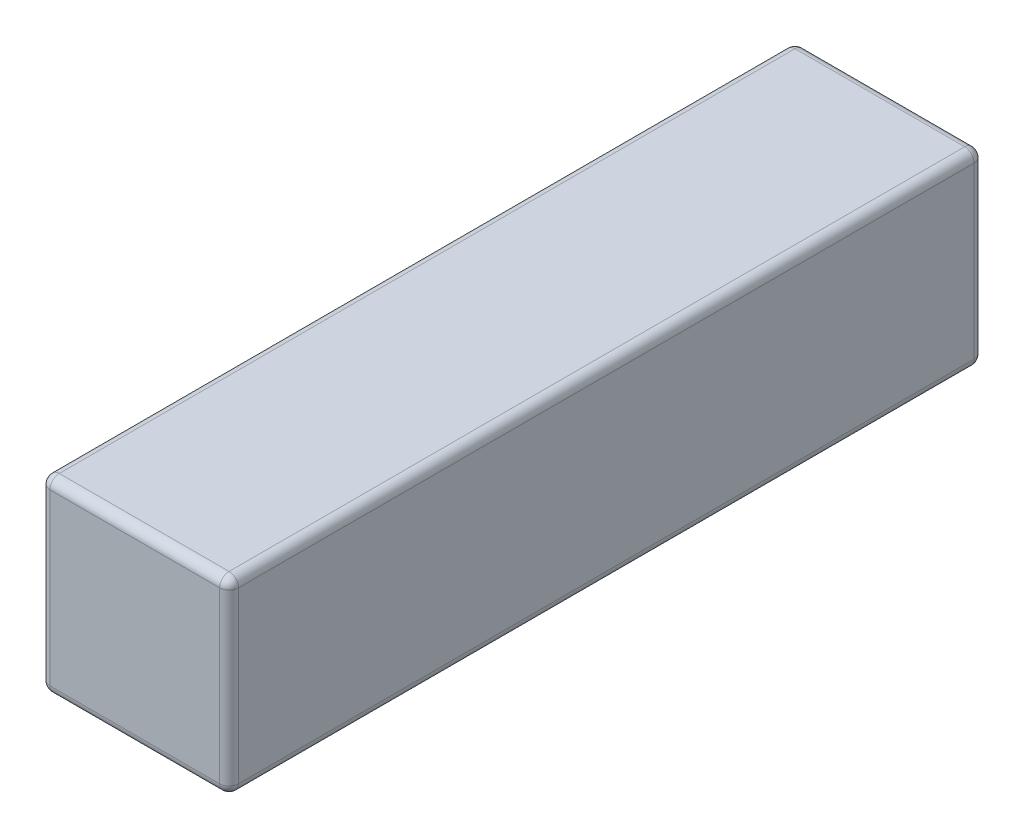
ISO-10303-21;
HEADER;
FILE_DESCRIPTION(('STEP AP214'),'2;1');
FILE_NAME('part.step','',(''),(''),'','','');
FILE_SCHEMA(('AUTOMOTIVE_DESIGN { 1 0 10303 214 1 1 1 1 }'));
ENDSEC;
DATA;
#1=APPLICATION_CONTEXT('core data for automotive mechanical design processes');
#2=APPLICATION_PROTOCOL_DEFINITION('international standard','automotive_design',2000,#1);
#3=PRODUCT_CONTEXT('',#1,'mechanical');
#4=PRODUCT('Part','Part','',(#3));
#5=PRODUCT_RELATED_PRODUCT_CATEGORY('part','',(#4));
#6=PRODUCT_DEFINITION_FORMATION('','',#4);
#7=PRODUCT_DEFINITION_CONTEXT('part definition',#1,'design');
#8=PRODUCT_DEFINITION('design','',#6,#7);
#9=PRODUCT_DEFINITION_SHAPE('','',#8);
#10=(LENGTH_UNIT() NAMED_UNIT(*) SI_UNIT(.MILLI.,.METRE.));
#11=(NAMED_UNIT(*) PLANE_ANGLE_UNIT() SI_UNIT($,.RADIAN.));
#12=(NAMED_UNIT(*) SI_UNIT($,.STERADIAN.) SOLID_ANGLE_UNIT());
#13=UNCERTAINTY_MEASURE_WITH_UNIT(LENGTH_MEASURE(1.E-05),#10,'distance_accuracy_value','');
#14=(GEOMETRIC_REPRESENTATION_CONTEXT(3) GLOBAL_UNCERTAINTY_ASSIGNED_CONTEXT((#13)) GLOBAL_UNIT_ASSIGNED_CONTEXT((#10,
#11,#12)) REPRESENTATION_CONTEXT('',''));
#15=CARTESIAN_POINT('',(0.,0.,0.));
#16=DIRECTION('',(0.,0.,1.));
#17=DIRECTION('',(1.,0.,0.));
#18=AXIS2_PLACEMENT_3D('',#15,#16,#17);
#19=CARTESIAN_POINT('',(1.5,-1.5,6.));
#20=DIRECTION('',(0.,1.,0.));
#21=DIRECTION('',(-1.,0.,0.));
#22=AXIS2_PLACEMENT_3D('',#19,#20,#21);
#23=PLANE('',#22);
#24=DIRECTION('',(1.,0.,0.));
#25=VECTOR('',#24,1.);
#26=CARTESIAN_POINT('',(1.5,-1.5,5.85));
#27=LINE('',#26,#25);
#28=CARTESIAN_POINT('',(1.35,-1.5,5.85));
#29=VERTEX_POINT('',#28);
#30=CARTESIAN_POINT('',(-1.35,-1.5,5.85));
#31=VERTEX_POINT('',#30);
#32=EDGE_CURVE('E131',#29,#31,#27,.F.);
#33=ORIENTED_EDGE('',*,*,#32,.T.);
#34=DIRECTION('',(0.,0.,-1.));
#35=VECTOR('',#34,1.);
#36=CARTESIAN_POINT('',(-1.35,-1.5,6.));
#37=LINE('',#36,#35);
#38=CARTESIAN_POINT('',(-1.35,-1.5,-5.85));
#39=VERTEX_POINT('',#38);
#40=EDGE_CURVE('E167',#31,#39,#37,.T.);
#41=ORIENTED_EDGE('',*,*,#40,.T.);
#42=DIRECTION('',(1.,0.,0.));
#43=VECTOR('',#42,1.);
#44=CARTESIAN_POINT('',(1.5,-1.5,-5.85));
#45=LINE('',#44,#43);
#46=CARTESIAN_POINT('',(1.35,-1.5,-5.85));
#47=VERTEX_POINT('',#46);
#48=EDGE_CURVE('E134',#39,#47,#45,.T.);
#49=ORIENTED_EDGE('',*,*,#48,.T.);
#50=DIRECTION('',(0.,0.,-1.));
#51=VECTOR('',#50,1.);
#52=CARTESIAN_POINT('',(1.35,-1.5,6.));
#53=LINE('',#52,#51);
#54=EDGE_CURVE('E127',#47,#29,#53,.F.);
#55=ORIENTED_EDGE('',*,*,#54,.T.);
#56=EDGE_LOOP('',(#33,#41,#49,#55));
#57=FACE_BOUND('',#56,.T.);
#58=ADVANCED_FACE('F39',(#57),#23,.F.);
#59=CARTESIAN_POINT('',(1.5,-1.5,6.));
#60=DIRECTION('',(-1.,0.,0.));
#61=DIRECTION('',(0.,0.,1.));
#62=AXIS2_PLACEMENT_3D('',#59,#60,#61);
#63=PLANE('',#62);
#64=DIRECTION('',(0.,1.,0.));
#65=VECTOR('',#64,1.);
#66=CARTESIAN_POINT('',(1.5,1.5,-5.85));
#67=LINE('',#66,#65);
#68=CARTESIAN_POINT('',(1.5,-1.35,-5.85));
#69=VERTEX_POINT('',#68);
#70=CARTESIAN_POINT('',(1.5,1.35,-5.85));
#71=VERTEX_POINT('',#70);
#72=EDGE_CURVE('E199',#69,#71,#67,.T.);
#73=ORIENTED_EDGE('',*,*,#72,.T.);
#74=DIRECTION('',(0.,0.,-1.));
#75=VECTOR('',#74,1.);
#76=CARTESIAN_POINT('',(1.5,1.35,6.));
#77=LINE('',#76,#75);
#78=CARTESIAN_POINT('',(1.5,1.35,5.85));
#79=VERTEX_POINT('',#78);
#80=EDGE_CURVE('E201',#71,#79,#77,.F.);
#81=ORIENTED_EDGE('',*,*,#80,.T.);
#82=DIRECTION('',(0.,1.,0.));
#83=VECTOR('',#82,1.);
#84=CARTESIAN_POINT('',(1.5,-1.5,5.85));
#85=LINE('',#84,#83);
#86=CARTESIAN_POINT('',(1.5,-1.35,5.85));
#87=VERTEX_POINT('',#86);
#88=EDGE_CURVE('E196',#79,#87,#85,.F.);
#89=ORIENTED_EDGE('',*,*,#88,.T.);
#90=DIRECTION('',(0.,0.,-1.));
#91=VECTOR('',#90,1.);
#92=CARTESIAN_POINT('',(1.5,-1.35,6.));
#93=LINE('',#92,#91);
#94=EDGE_CURVE('E144',#87,#69,#93,.T.);
#95=ORIENTED_EDGE('',*,*,#94,.T.);
#96=EDGE_LOOP('',(#73,#81,#89,#95));
#97=FACE_BOUND('',#96,.T.);
#98=ADVANCED_FACE('F300',(#97),#63,.F.);
#99=CARTESIAN_POINT('',(1.5,1.5,6.));
#100=DIRECTION('',(0.,-1.,0.));
#101=DIRECTION('',(1.,0.,0.));
#102=AXIS2_PLACEMENT_3D('',#99,#100,#101);
#103=PLANE('',#102);
#104=DIRECTION('',(-1.,0.,0.));
#105=VECTOR('',#104,1.);
#106=CARTESIAN_POINT('',(-1.5,1.5,-5.85));
#107=LINE('',#106,#105);
#108=CARTESIAN_POINT('',(1.35,1.5,-5.85));
#109=VERTEX_POINT('',#108);
#110=CARTESIAN_POINT('',(-1.35,1.5,-5.85));
#111=VERTEX_POINT('',#110);
#112=EDGE_CURVE('E191',#109,#111,#107,.T.);
#113=ORIENTED_EDGE('',*,*,#112,.T.);
#114=DIRECTION('',(0.,0.,-1.));
#115=VECTOR('',#114,1.);
#116=CARTESIAN_POINT('',(-1.35,1.5,6.));
#117=LINE('',#116,#115);
#118=CARTESIAN_POINT('',(-1.35,1.5,5.85));
#119=VERTEX_POINT('',#118);
#120=EDGE_CURVE('E193',#111,#119,#117,.F.);
#121=ORIENTED_EDGE('',*,*,#120,.T.);
#122=DIRECTION('',(-1.,0.,0.));
#123=VECTOR('',#122,1.);
#124=CARTESIAN_POINT('',(1.5,1.5,5.85));
#125=LINE('',#124,#123);
#126=CARTESIAN_POINT('',(1.35,1.5,5.85));
#127=VERTEX_POINT('',#126);
#128=EDGE_CURVE('E187',#119,#127,#125,.F.);
#129=ORIENTED_EDGE('',*,*,#128,.T.);
#130=DIRECTION('',(0.,0.,-1.));
#131=VECTOR('',#130,1.);
#132=CARTESIAN_POINT('',(1.35,1.5,6.));
#133=LINE('',#132,#131);
#134=EDGE_CURVE('E189',#127,#109,#133,.T.);
#135=ORIENTED_EDGE('',*,*,#134,.T.);
#136=EDGE_LOOP('',(#113,#121,#129,#135));
#137=FACE_BOUND('',#136,.T.);
#138=ADVANCED_FACE('F280',(#137),#103,.F.);
#139=CARTESIAN_POINT('',(-1.5,-1.5,6.));
#140=DIRECTION('',(1.,0.,0.));
#141=DIRECTION('',(0.,0.,-1.));
#142=AXIS2_PLACEMENT_3D('',#139,#140,#141);
#143=PLANE('',#142);
#144=DIRECTION('',(0.,-1.,0.));
#145=VECTOR('',#144,1.);
#146=CARTESIAN_POINT('',(-1.5,-1.5,-5.85));
#147=LINE('',#146,#145);
#148=CARTESIAN_POINT('',(-1.5,1.35,-5.85));
#149=VERTEX_POINT('',#148);
#150=CARTESIAN_POINT('',(-1.5,-1.35,-5.85));
#151=VERTEX_POINT('',#150);
#152=EDGE_CURVE('E173',#149,#151,#147,.T.);
#153=ORIENTED_EDGE('',*,*,#152,.T.);
#154=DIRECTION('',(0.,0.,-1.));
#155=VECTOR('',#154,1.);
#156=CARTESIAN_POINT('',(-1.5,-1.35,6.));
#157=LINE('',#156,#155);
#158=CARTESIAN_POINT('',(-1.5,-1.35,5.85));
#159=VERTEX_POINT('',#158);
#160=EDGE_CURVE('E175',#151,#159,#157,.F.);
#161=ORIENTED_EDGE('',*,*,#160,.T.);
#162=DIRECTION('',(0.,-1.,0.));
#163=VECTOR('',#162,1.);
#164=CARTESIAN_POINT('',(-1.5,-1.5,5.85));
#165=LINE('',#164,#163);
#166=CARTESIAN_POINT('',(-1.5,1.35,5.85));
#167=VERTEX_POINT('',#166);
#168=EDGE_CURVE('E169',#159,#167,#165,.F.);
#169=ORIENTED_EDGE('',*,*,#168,.T.);
#170=DIRECTION('',(0.,0.,-1.));
#171=VECTOR('',#170,1.);
#172=CARTESIAN_POINT('',(-1.5,1.35,6.));
#173=LINE('',#172,#171);
#174=EDGE_CURVE('E171',#167,#149,#173,.T.);
#175=ORIENTED_EDGE('',*,*,#174,.T.);
#176=EDGE_LOOP('',(#153,#161,#169,#175));
#177=FACE_BOUND('',#176,.T.);
#178=ADVANCED_FACE('F307',(#177),#143,.F.);
#179=CARTESIAN_POINT('',(0.,0.,6.));
#180=DIRECTION('',(0.,0.,-1.));
#181=DIRECTION('',(-1.,0.,0.));
#182=AXIS2_PLACEMENT_3D('',#179,#180,#181);
#183=PLANE('',#182);
#184=DIRECTION('',(-1.,0.,0.));
#185=VECTOR('',#184,1.);
#186=CARTESIAN_POINT('',(0.,1.35,6.));
#187=LINE('',#186,#185);
#188=CARTESIAN_POINT('',(1.35,1.35,6.));
#189=VERTEX_POINT('',#188);
#190=CARTESIAN_POINT('',(-1.35,1.35,6.));
#191=VERTEX_POINT('',#190);
#192=EDGE_CURVE('E48',#189,#191,#187,.T.);
#193=ORIENTED_EDGE('',*,*,#192,.T.);
#194=DIRECTION('',(0.,-1.,0.));
#195=VECTOR('',#194,1.);
#196=CARTESIAN_POINT('',(-1.35,0.,6.));
#197=LINE('',#196,#195);
#198=CARTESIAN_POINT('',(-1.35,-1.35,6.));
#199=VERTEX_POINT('',#198);
#200=EDGE_CURVE('E11',#191,#199,#197,.T.);
#201=ORIENTED_EDGE('',*,*,#200,.T.);
#202=DIRECTION('',(1.,0.,0.));
#203=VECTOR('',#202,1.);
#204=CARTESIAN_POINT('',(0.,-1.35,6.));
#205=LINE('',#204,#203);
#206=CARTESIAN_POINT('',(1.35,-1.35,6.));
#207=VERTEX_POINT('',#206);
#208=EDGE_CURVE('E204',#199,#207,#205,.T.);
#209=ORIENTED_EDGE('',*,*,#208,.T.);
#210=DIRECTION('',(0.,1.,0.));
#211=VECTOR('',#210,1.);
#212=CARTESIAN_POINT('',(1.35,0.,6.));
#213=LINE('',#212,#211);
#214=EDGE_CURVE('E59',#207,#189,#213,.T.);
#215=ORIENTED_EDGE('',*,*,#214,.T.);
#216=EDGE_LOOP('',(#193,#201,#209,#215));
#217=FACE_BOUND('',#216,.T.);
#218=ADVANCED_FACE('F371',(#217),#183,.F.);
#219=CARTESIAN_POINT('',(0.,0.,-6.));
#220=DIRECTION('',(0.,0.,-1.));
#221=DIRECTION('',(-1.,0.,0.));
#222=AXIS2_PLACEMENT_3D('',#219,#220,#221);
#223=PLANE('',#222);
#224=DIRECTION('',(1.,0.,0.));
#225=VECTOR('',#224,1.);
#226=CARTESIAN_POINT('',(-1.5,-1.35,-6.));
#227=LINE('',#226,#225);
#228=CARTESIAN_POINT('',(1.35,-1.35,-6.));
#229=VERTEX_POINT('',#228);
#230=CARTESIAN_POINT('',(-1.35,-1.35,-6.));
#231=VERTEX_POINT('',#230);
#232=EDGE_CURVE('E182',#229,#231,#227,.F.);
#233=ORIENTED_EDGE('',*,*,#232,.T.);
#234=DIRECTION('',(0.,-1.,0.));
#235=VECTOR('',#234,1.);
#236=CARTESIAN_POINT('',(-1.35,1.5,-6.));
#237=LINE('',#236,#235);
#238=CARTESIAN_POINT('',(-1.35,1.35,-6.));
#239=VERTEX_POINT('',#238);
#240=EDGE_CURVE('E184',#231,#239,#237,.F.);
#241=ORIENTED_EDGE('',*,*,#240,.T.);
#242=DIRECTION('',(-1.,0.,0.));
#243=VECTOR('',#242,1.);
#244=CARTESIAN_POINT('',(1.5,1.35,-6.));
#245=LINE('',#244,#243);
#246=CARTESIAN_POINT('',(1.35,1.35,-6.));
#247=VERTEX_POINT('',#246);
#248=EDGE_CURVE('E180',#239,#247,#245,.F.);
#249=ORIENTED_EDGE('',*,*,#248,.T.);
#250=DIRECTION('',(0.,1.,0.));
#251=VECTOR('',#250,1.);
#252=CARTESIAN_POINT('',(1.35,-1.5,-6.));
#253=LINE('',#252,#251);
#254=EDGE_CURVE('E178',#247,#229,#253,.F.);
#255=ORIENTED_EDGE('',*,*,#254,.T.);
#256=EDGE_LOOP('',(#233,#241,#249,#255));
#257=FACE_BOUND('',#256,.T.);
#258=ADVANCED_FACE('F271',(#257),#223,.T.);
#259=CARTESIAN_POINT('',(1.35,1.35,6.));
#260=DIRECTION('',(0.,0.,-1.));
#261=DIRECTION('',(-1.,0.,0.));
#262=AXIS2_PLACEMENT_3D('',#259,#260,#261);
#263=CYLINDRICAL_SURFACE('',#262,0.15);
#264=CARTESIAN_POINT('',(1.35,1.35,5.85));
#265=DIRECTION('',(0.,0.,1.));
#266=DIRECTION('',(1.,0.,0.));
#267=AXIS2_PLACEMENT_3D('',#264,#265,#266);
#268=CIRCLE('',#267,0.15);
#269=EDGE_CURVE('E43',#79,#127,#268,.T.);
#270=ORIENTED_EDGE('',*,*,#269,.F.);
#271=ORIENTED_EDGE('',*,*,#80,.F.);
#272=CARTESIAN_POINT('',(1.35,1.35,-5.85));
#273=DIRECTION('',(0.,0.,-1.));
#274=DIRECTION('',(-1.,0.,0.));
#275=AXIS2_PLACEMENT_3D('',#272,#273,#274);
#276=CIRCLE('',#275,0.15);
#277=EDGE_CURVE('E164',#109,#71,#276,.T.);
#278=ORIENTED_EDGE('',*,*,#277,.F.);
#279=ORIENTED_EDGE('',*,*,#134,.F.);
#280=EDGE_LOOP('',(#270,#271,#278,#279));
#281=FACE_BOUND('',#280,.T.);
#282=ADVANCED_FACE('F41',(#281),#263,.T.);
#283=CARTESIAN_POINT('',(1.35,1.35,5.85));
#284=DIRECTION('',(0.,0.,1.));
#285=DIRECTION('',(1.,0.,0.));
#286=AXIS2_PLACEMENT_3D('',#283,#284,#285);
#287=SPHERICAL_SURFACE('',#286,0.15);
#288=CARTESIAN_POINT('',(1.35,1.35,5.85));
#289=DIRECTION('',(0.,1.,0.));
#290=DIRECTION('',(0.,0.,1.));
#291=AXIS2_PLACEMENT_3D('',#288,#289,#290);
#292=CIRCLE('',#291,0.15);
#293=EDGE_CURVE('E250',#79,#189,#292,.F.);
#294=ORIENTED_EDGE('',*,*,#293,.F.);
#295=ORIENTED_EDGE('',*,*,#269,.T.);
#296=CARTESIAN_POINT('',(1.35,1.35,5.85));
#297=DIRECTION('',(1.,0.,0.));
#298=DIRECTION('',(0.,0.,-1.));
#299=AXIS2_PLACEMENT_3D('',#296,#297,#298);
#300=CIRCLE('',#299,0.15);
#301=EDGE_CURVE('E252',#189,#127,#300,.F.);
#302=ORIENTED_EDGE('',*,*,#301,.F.);
#303=EDGE_LOOP('',(#294,#295,#302));
#304=FACE_BOUND('',#303,.T.);
#305=ADVANCED_FACE('F296',(#304),#287,.T.);
#306=CARTESIAN_POINT('',(1.35,1.35,-5.85));
#307=DIRECTION('',(0.,0.,1.));
#308=DIRECTION('',(1.,0.,0.));
#309=AXIS2_PLACEMENT_3D('',#306,#307,#308);
#310=SPHERICAL_SURFACE('',#309,0.15);
#311=CARTESIAN_POINT('',(1.35,1.35,-5.85));
#312=DIRECTION('',(1.,0.,0.));
#313=DIRECTION('',(0.,0.,-1.));
#314=AXIS2_PLACEMENT_3D('',#311,#312,#313);
#315=CIRCLE('',#314,0.15);
#316=EDGE_CURVE('E244',#109,#247,#315,.F.);
#317=ORIENTED_EDGE('',*,*,#316,.F.);
#318=ORIENTED_EDGE('',*,*,#277,.T.);
#319=CARTESIAN_POINT('',(1.35,1.35,-5.85));
#320=DIRECTION('',(0.,1.,0.));
#321=DIRECTION('',(0.,0.,1.));
#322=AXIS2_PLACEMENT_3D('',#319,#320,#321);
#323=CIRCLE('',#322,0.15);
#324=EDGE_CURVE('E247',#247,#71,#323,.F.);
#325=ORIENTED_EDGE('',*,*,#324,.F.);
#326=EDGE_LOOP('',(#317,#318,#325));
#327=FACE_BOUND('',#326,.T.);
#328=ADVANCED_FACE('F259',(#327),#310,.T.);
#329=CARTESIAN_POINT('',(0.,1.35,5.85));
#330=DIRECTION('',(-1.,0.,0.));
#331=DIRECTION('',(0.,-1.,0.));
#332=AXIS2_PLACEMENT_3D('',#329,#330,#331);
#333=CYLINDRICAL_SURFACE('',#332,0.15);
#334=ORIENTED_EDGE('',*,*,#301,.T.);
#335=ORIENTED_EDGE('',*,*,#128,.F.);
#336=CARTESIAN_POINT('',(-1.35,1.35,5.85));
#337=DIRECTION('',(-1.,0.,0.));
#338=DIRECTION('',(0.,0.,1.));
#339=AXIS2_PLACEMENT_3D('',#336,#337,#338);
#340=CIRCLE('',#339,0.15);
#341=EDGE_CURVE('E239',#191,#119,#340,.T.);
#342=ORIENTED_EDGE('',*,*,#341,.F.);
#343=ORIENTED_EDGE('',*,*,#192,.F.);
#344=EDGE_LOOP('',(#334,#335,#342,#343));
#345=FACE_BOUND('',#344,.T.);
#346=ADVANCED_FACE('F291',(#345),#333,.T.);
#347=CARTESIAN_POINT('',(1.35,0.,5.85));
#348=DIRECTION('',(0.,1.,0.));
#349=DIRECTION('',(0.,0.,1.));
#350=AXIS2_PLACEMENT_3D('',#347,#348,#349);
#351=CYLINDRICAL_SURFACE('',#350,0.15);
#352=ORIENTED_EDGE('',*,*,#293,.T.);
#353=ORIENTED_EDGE('',*,*,#214,.F.);
#354=CARTESIAN_POINT('',(1.35,-1.35,5.85));
#355=DIRECTION('',(0.,-1.,0.));
#356=DIRECTION('',(0.,0.,-1.));
#357=AXIS2_PLACEMENT_3D('',#354,#355,#356);
#358=CIRCLE('',#357,0.15);
#359=EDGE_CURVE('E148',#87,#207,#358,.T.);
#360=ORIENTED_EDGE('',*,*,#359,.F.);
#361=ORIENTED_EDGE('',*,*,#88,.F.);
#362=EDGE_LOOP('',(#352,#353,#360,#361));
#363=FACE_BOUND('',#362,.T.);
#364=ADVANCED_FACE('F298',(#363),#351,.T.);
#365=CARTESIAN_POINT('',(1.35,-1.35,6.));
#366=DIRECTION('',(0.,0.,-1.));
#367=DIRECTION('',(-1.,0.,0.));
#368=AXIS2_PLACEMENT_3D('',#365,#366,#367);
#369=CYLINDRICAL_SURFACE('',#368,0.15);
#370=CARTESIAN_POINT('',(1.35,-1.35,-5.85));
#371=DIRECTION('',(0.,0.,-1.));
#372=DIRECTION('',(-1.,0.,0.));
#373=AXIS2_PLACEMENT_3D('',#370,#371,#372);
#374=CIRCLE('',#373,0.15);
#375=EDGE_CURVE('E149',#69,#47,#374,.T.);
#376=ORIENTED_EDGE('',*,*,#375,.F.);
#377=ORIENTED_EDGE('',*,*,#94,.F.);
#378=CARTESIAN_POINT('',(1.35,-1.35,5.85));
#379=DIRECTION('',(0.,0.,1.));
#380=DIRECTION('',(1.,0.,0.));
#381=AXIS2_PLACEMENT_3D('',#378,#379,#380);
#382=CIRCLE('',#381,0.15);
#383=EDGE_CURVE('E141',#29,#87,#382,.T.);
#384=ORIENTED_EDGE('',*,*,#383,.F.);
#385=ORIENTED_EDGE('',*,*,#54,.F.);
#386=EDGE_LOOP('',(#376,#377,#384,#385));
#387=FACE_BOUND('',#386,.T.);
#388=ADVANCED_FACE('F143',(#387),#369,.T.);
#389=CARTESIAN_POINT('',(1.35,-1.5,-5.85));
#390=DIRECTION('',(0.,-1.,0.));
#391=DIRECTION('',(0.,0.,-1.));
#392=AXIS2_PLACEMENT_3D('',#389,#390,#391);
#393=CYLINDRICAL_SURFACE('',#392,0.15);
#394=ORIENTED_EDGE('',*,*,#324,.T.);
#395=ORIENTED_EDGE('',*,*,#72,.F.);
#396=CARTESIAN_POINT('',(1.35,-1.35,-5.85));
#397=DIRECTION('',(0.,-1.,0.));
#398=DIRECTION('',(0.,0.,-1.));
#399=AXIS2_PLACEMENT_3D('',#396,#397,#398);
#400=CIRCLE('',#399,0.15);
#401=EDGE_CURVE('E234',#229,#69,#400,.T.);
#402=ORIENTED_EDGE('',*,*,#401,.F.);
#403=ORIENTED_EDGE('',*,*,#254,.F.);
#404=EDGE_LOOP('',(#394,#395,#402,#403));
#405=FACE_BOUND('',#404,.T.);
#406=ADVANCED_FACE('F267',(#405),#393,.T.);
#407=CARTESIAN_POINT('',(1.5,1.35,-5.85));
#408=DIRECTION('',(1.,0.,0.));
#409=DIRECTION('',(0.,1.,0.));
#410=AXIS2_PLACEMENT_3D('',#407,#408,#409);
#411=CYLINDRICAL_SURFACE('',#410,0.15);
#412=ORIENTED_EDGE('',*,*,#316,.T.);
#413=ORIENTED_EDGE('',*,*,#248,.F.);
#414=CARTESIAN_POINT('',(-1.35,1.35,-5.85));
#415=DIRECTION('',(-1.,0.,0.));
#416=DIRECTION('',(0.,0.,1.));
#417=AXIS2_PLACEMENT_3D('',#414,#415,#416);
#418=CIRCLE('',#417,0.15);
#419=EDGE_CURVE('E231',#111,#239,#418,.T.);
#420=ORIENTED_EDGE('',*,*,#419,.F.);
#421=ORIENTED_EDGE('',*,*,#112,.F.);
#422=EDGE_LOOP('',(#412,#413,#420,#421));
#423=FACE_BOUND('',#422,.T.);
#424=ADVANCED_FACE('F277',(#423),#411,.T.);
#425=CARTESIAN_POINT('',(-1.35,1.35,6.));
#426=DIRECTION('',(0.,0.,-1.));
#427=DIRECTION('',(-1.,0.,0.));
#428=AXIS2_PLACEMENT_3D('',#425,#426,#427);
#429=CYLINDRICAL_SURFACE('',#428,0.15);
#430=CARTESIAN_POINT('',(-1.35,1.35,5.85));
#431=DIRECTION('',(0.,0.,1.));
#432=DIRECTION('',(1.,0.,0.));
#433=AXIS2_PLACEMENT_3D('',#430,#431,#432);
#434=CIRCLE('',#433,0.15);
#435=EDGE_CURVE('E241',#119,#167,#434,.T.);
#436=ORIENTED_EDGE('',*,*,#435,.F.);
#437=ORIENTED_EDGE('',*,*,#120,.F.);
#438=CARTESIAN_POINT('',(-1.35,1.35,-5.85));
#439=DIRECTION('',(0.,0.,-1.));
#440=DIRECTION('',(-1.,0.,0.));
#441=AXIS2_PLACEMENT_3D('',#438,#439,#440);
#442=CIRCLE('',#441,0.15);
#443=EDGE_CURVE('E228',#149,#111,#442,.T.);
#444=ORIENTED_EDGE('',*,*,#443,.F.);
#445=ORIENTED_EDGE('',*,*,#174,.F.);
#446=EDGE_LOOP('',(#436,#437,#444,#445));
#447=FACE_BOUND('',#446,.T.);
#448=ADVANCED_FACE('F284',(#447),#429,.T.);
#449=CARTESIAN_POINT('',(-1.35,1.35,5.85));
#450=DIRECTION('',(0.,0.,1.));
#451=DIRECTION('',(1.,0.,0.));
#452=AXIS2_PLACEMENT_3D('',#449,#450,#451);
#453=SPHERICAL_SURFACE('',#452,0.15);
#454=ORIENTED_EDGE('',*,*,#341,.T.);
#455=ORIENTED_EDGE('',*,*,#435,.T.);
#456=CARTESIAN_POINT('',(-1.35,1.35,5.85));
#457=DIRECTION('',(0.,1.,0.));
#458=DIRECTION('',(0.,0.,1.));
#459=AXIS2_PLACEMENT_3D('',#456,#457,#458);
#460=CIRCLE('',#459,0.15);
#461=EDGE_CURVE('E156',#191,#167,#460,.F.);
#462=ORIENTED_EDGE('',*,*,#461,.F.);
#463=EDGE_LOOP('',(#454,#455,#462));
#464=FACE_BOUND('',#463,.T.);
#465=ADVANCED_FACE('F348',(#464),#453,.T.);
#466=CARTESIAN_POINT('',(1.35,-1.35,5.85));
#467=DIRECTION('',(0.,0.,1.));
#468=DIRECTION('',(1.,0.,0.));
#469=AXIS2_PLACEMENT_3D('',#466,#467,#468);
#470=SPHERICAL_SURFACE('',#469,0.15);
#471=ORIENTED_EDGE('',*,*,#383,.T.);
#472=ORIENTED_EDGE('',*,*,#359,.T.);
#473=CARTESIAN_POINT('',(1.35,-1.35,5.85));
#474=DIRECTION('',(1.,0.,0.));
#475=DIRECTION('',(0.,0.,-1.));
#476=AXIS2_PLACEMENT_3D('',#473,#474,#475);
#477=CIRCLE('',#476,0.15);
#478=EDGE_CURVE('E152',#29,#207,#477,.F.);
#479=ORIENTED_EDGE('',*,*,#478,.F.);
#480=EDGE_LOOP('',(#471,#472,#479));
#481=FACE_BOUND('',#480,.T.);
#482=ADVANCED_FACE('F153',(#481),#470,.T.);
#483=CARTESIAN_POINT('',(1.35,-1.35,-5.85));
#484=DIRECTION('',(0.,0.,1.));
#485=DIRECTION('',(1.,0.,0.));
#486=AXIS2_PLACEMENT_3D('',#483,#484,#485);
#487=SPHERICAL_SURFACE('',#486,0.15);
#488=ORIENTED_EDGE('',*,*,#401,.T.);
#489=ORIENTED_EDGE('',*,*,#375,.T.);
#490=CARTESIAN_POINT('',(1.35,-1.35,-5.85));
#491=DIRECTION('',(1.,0.,0.));
#492=DIRECTION('',(0.,0.,-1.));
#493=AXIS2_PLACEMENT_3D('',#490,#491,#492);
#494=CIRCLE('',#493,0.15);
#495=EDGE_CURVE('E157',#229,#47,#494,.F.);
#496=ORIENTED_EDGE('',*,*,#495,.F.);
#497=EDGE_LOOP('',(#488,#489,#496));
#498=FACE_BOUND('',#497,.T.);
#499=ADVANCED_FACE('F341',(#498),#487,.T.);
#500=CARTESIAN_POINT('',(-1.35,1.35,-5.85));
#501=DIRECTION('',(0.,0.,1.));
#502=DIRECTION('',(1.,0.,0.));
#503=AXIS2_PLACEMENT_3D('',#500,#501,#502);
#504=SPHERICAL_SURFACE('',#503,0.15);
#505=ORIENTED_EDGE('',*,*,#443,.T.);
#506=ORIENTED_EDGE('',*,*,#419,.T.);
#507=CARTESIAN_POINT('',(-1.35,1.35,-5.85));
#508=DIRECTION('',(0.,1.,0.));
#509=DIRECTION('',(0.,0.,1.));
#510=AXIS2_PLACEMENT_3D('',#507,#508,#509);
#511=CIRCLE('',#510,0.15);
#512=EDGE_CURVE('E222',#149,#239,#511,.F.);
#513=ORIENTED_EDGE('',*,*,#512,.F.);
#514=EDGE_LOOP('',(#505,#506,#513));
#515=FACE_BOUND('',#514,.T.);
#516=ADVANCED_FACE('F337',(#515),#504,.T.);
#517=CARTESIAN_POINT('',(-1.35,0.,5.85));
#518=DIRECTION('',(0.,-1.,0.));
#519=DIRECTION('',(0.,0.,-1.));
#520=AXIS2_PLACEMENT_3D('',#517,#518,#519);
#521=CYLINDRICAL_SURFACE('',#520,0.15);
#522=ORIENTED_EDGE('',*,*,#461,.T.);
#523=ORIENTED_EDGE('',*,*,#168,.F.);
#524=CARTESIAN_POINT('',(-1.35,-1.35,5.85));
#525=DIRECTION('',(0.,-1.,0.));
#526=DIRECTION('',(0.,0.,-1.));
#527=AXIS2_PLACEMENT_3D('',#524,#525,#526);
#528=CIRCLE('',#527,0.15);
#529=EDGE_CURVE('E219',#199,#159,#528,.T.);
#530=ORIENTED_EDGE('',*,*,#529,.F.);
#531=ORIENTED_EDGE('',*,*,#200,.F.);
#532=EDGE_LOOP('',(#522,#523,#530,#531));
#533=FACE_BOUND('',#532,.T.);
#534=ADVANCED_FACE('F334',(#533),#521,.T.);
#535=CARTESIAN_POINT('',(0.,-1.35,5.85));
#536=DIRECTION('',(1.,0.,0.));
#537=DIRECTION('',(0.,1.,0.));
#538=AXIS2_PLACEMENT_3D('',#535,#536,#537);
#539=CYLINDRICAL_SURFACE('',#538,0.15);
#540=ORIENTED_EDGE('',*,*,#478,.T.);
#541=ORIENTED_EDGE('',*,*,#208,.F.);
#542=CARTESIAN_POINT('',(-1.35,-1.35,5.85));
#543=DIRECTION('',(-1.,0.,0.));
#544=DIRECTION('',(0.,0.,1.));
#545=AXIS2_PLACEMENT_3D('',#542,#543,#544);
#546=CIRCLE('',#545,0.15);
#547=EDGE_CURVE('E160',#31,#199,#546,.T.);
#548=ORIENTED_EDGE('',*,*,#547,.F.);
#549=ORIENTED_EDGE('',*,*,#32,.F.);
#550=EDGE_LOOP('',(#540,#541,#548,#549));
#551=FACE_BOUND('',#550,.T.);
#552=ADVANCED_FACE('F159',(#551),#539,.T.);
#553=CARTESIAN_POINT('',(1.5,-1.35,-5.85));
#554=DIRECTION('',(-1.,0.,0.));
#555=DIRECTION('',(0.,-1.,0.));
#556=AXIS2_PLACEMENT_3D('',#553,#554,#555);
#557=CYLINDRICAL_SURFACE('',#556,0.15);
#558=ORIENTED_EDGE('',*,*,#495,.T.);
#559=ORIENTED_EDGE('',*,*,#48,.F.);
#560=CARTESIAN_POINT('',(-1.35,-1.35,-5.85));
#561=DIRECTION('',(-1.,0.,0.));
#562=DIRECTION('',(0.,0.,1.));
#563=AXIS2_PLACEMENT_3D('',#560,#561,#562);
#564=CIRCLE('',#563,0.15);
#565=EDGE_CURVE('E215',#231,#39,#564,.T.);
#566=ORIENTED_EDGE('',*,*,#565,.F.);
#567=ORIENTED_EDGE('',*,*,#232,.F.);
#568=EDGE_LOOP('',(#558,#559,#566,#567));
#569=FACE_BOUND('',#568,.T.);
#570=ADVANCED_FACE('F327',(#569),#557,.T.);
#571=CARTESIAN_POINT('',(-1.35,-1.5,-5.85));
#572=DIRECTION('',(0.,1.,0.));
#573=DIRECTION('',(0.,0.,1.));
#574=AXIS2_PLACEMENT_3D('',#571,#572,#573);
#575=CYLINDRICAL_SURFACE('',#574,0.15);
#576=ORIENTED_EDGE('',*,*,#512,.T.);
#577=ORIENTED_EDGE('',*,*,#240,.F.);
#578=CARTESIAN_POINT('',(-1.35,-1.35,-5.85));
#579=DIRECTION('',(0.,-1.,0.));
#580=DIRECTION('',(0.,0.,-1.));
#581=AXIS2_PLACEMENT_3D('',#578,#579,#580);
#582=CIRCLE('',#581,0.15);
#583=EDGE_CURVE('E212',#151,#231,#582,.T.);
#584=ORIENTED_EDGE('',*,*,#583,.F.);
#585=ORIENTED_EDGE('',*,*,#152,.F.);
#586=EDGE_LOOP('',(#576,#577,#584,#585));
#587=FACE_BOUND('',#586,.T.);
#588=ADVANCED_FACE('F323',(#587),#575,.T.);
#589=CARTESIAN_POINT('',(-1.35,-1.35,5.85));
#590=DIRECTION('',(0.,0.,1.));
#591=DIRECTION('',(1.,0.,0.));
#592=AXIS2_PLACEMENT_3D('',#589,#590,#591);
#593=SPHERICAL_SURFACE('',#592,0.15);
#594=ORIENTED_EDGE('',*,*,#547,.T.);
#595=ORIENTED_EDGE('',*,*,#529,.T.);
#596=CARTESIAN_POINT('',(-1.35,-1.35,5.85));
#597=DIRECTION('',(0.,0.,1.));
#598=DIRECTION('',(1.,0.,0.));
#599=AXIS2_PLACEMENT_3D('',#596,#597,#598);
#600=CIRCLE('',#599,0.15);
#601=EDGE_CURVE('E210',#31,#159,#600,.F.);
#602=ORIENTED_EDGE('',*,*,#601,.F.);
#603=EDGE_LOOP('',(#594,#595,#602));
#604=FACE_BOUND('',#603,.T.);
#605=ADVANCED_FACE('F319',(#604),#593,.T.);
#606=CARTESIAN_POINT('',(-1.35,-1.35,-5.85));
#607=DIRECTION('',(0.,0.,1.));
#608=DIRECTION('',(1.,0.,0.));
#609=AXIS2_PLACEMENT_3D('',#606,#607,#608);
#610=SPHERICAL_SURFACE('',#609,0.15);
#611=ORIENTED_EDGE('',*,*,#583,.T.);
#612=ORIENTED_EDGE('',*,*,#565,.T.);
#613=CARTESIAN_POINT('',(-1.35,-1.35,-5.85));
#614=DIRECTION('',(0.,0.,-1.));
#615=DIRECTION('',(-1.,0.,0.));
#616=AXIS2_PLACEMENT_3D('',#613,#614,#615);
#617=CIRCLE('',#616,0.15);
#618=EDGE_CURVE('E208',#151,#39,#617,.F.);
#619=ORIENTED_EDGE('',*,*,#618,.F.);
#620=EDGE_LOOP('',(#611,#612,#619));
#621=FACE_BOUND('',#620,.T.);
#622=ADVANCED_FACE('F315',(#621),#610,.T.);
#623=CARTESIAN_POINT('',(-1.35,-1.35,6.));
#624=DIRECTION('',(0.,0.,-1.));
#625=DIRECTION('',(-1.,0.,0.));
#626=AXIS2_PLACEMENT_3D('',#623,#624,#625);
#627=CYLINDRICAL_SURFACE('',#626,0.15);
#628=ORIENTED_EDGE('',*,*,#601,.T.);
#629=ORIENTED_EDGE('',*,*,#160,.F.);
#630=ORIENTED_EDGE('',*,*,#618,.T.);
#631=ORIENTED_EDGE('',*,*,#40,.F.);
#632=EDGE_LOOP('',(#628,#629,#630,#631));
#633=FACE_BOUND('',#632,.T.);
#634=ADVANCED_FACE('F312',(#633),#627,.T.);
#635=CLOSED_SHELL('',(#58,#98,#138,#178,#218,#258,#282,#305,#328,#346,#364,#388,#406,#424,#448,
#465,#482,#499,#516,#534,#552,#570,#588,#605,#622,#634));
#636=MANIFOLD_SOLID_BREP('B2',#635);
#637=ADVANCED_BREP_SHAPE_REPRESENTATION('',(#18,#636),#14);
#638=SHAPE_DEFINITION_REPRESENTATION(#9,#637);
ENDSEC;
END-ISO-10303-21;
